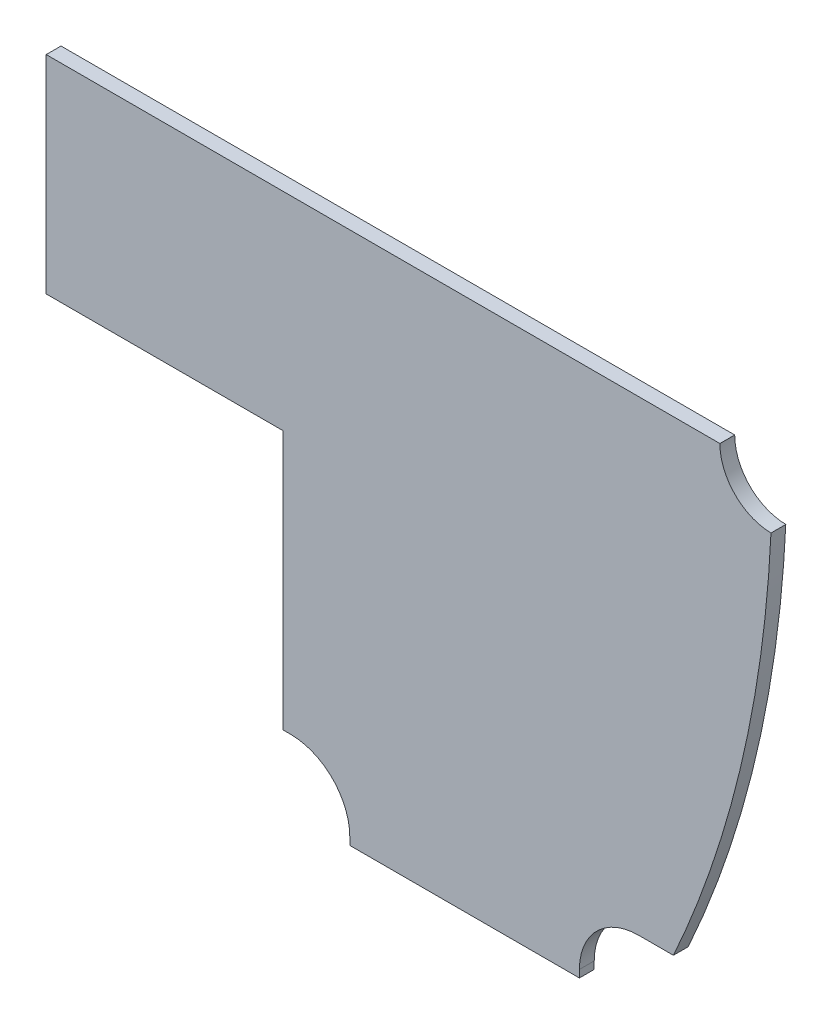
ISO-10303-21;
HEADER;
FILE_DESCRIPTION(('STEP AP214'),'2;1');
FILE_NAME('part.step','',(''),(''),'','','');
FILE_SCHEMA(('AUTOMOTIVE_DESIGN { 1 0 10303 214 1 1 1 1 }'));
ENDSEC;
DATA;
#1=APPLICATION_CONTEXT('core data for automotive mechanical design processes');
#2=APPLICATION_PROTOCOL_DEFINITION('international standard','automotive_design',2000,#1);
#3=PRODUCT_CONTEXT('',#1,'mechanical');
#4=PRODUCT('Part','Part','',(#3));
#5=PRODUCT_RELATED_PRODUCT_CATEGORY('part','',(#4));
#6=PRODUCT_DEFINITION_FORMATION('','',#4);
#7=PRODUCT_DEFINITION_CONTEXT('part definition',#1,'design');
#8=PRODUCT_DEFINITION('design','',#6,#7);
#9=PRODUCT_DEFINITION_SHAPE('','',#8);
#10=(LENGTH_UNIT() NAMED_UNIT(*) SI_UNIT(.MILLI.,.METRE.));
#11=(NAMED_UNIT(*) PLANE_ANGLE_UNIT() SI_UNIT($,.RADIAN.));
#12=(NAMED_UNIT(*) SI_UNIT($,.STERADIAN.) SOLID_ANGLE_UNIT());
#13=UNCERTAINTY_MEASURE_WITH_UNIT(LENGTH_MEASURE(1.E-05),#10,'distance_accuracy_value','');
#14=(GEOMETRIC_REPRESENTATION_CONTEXT(3) GLOBAL_UNCERTAINTY_ASSIGNED_CONTEXT((#13)) GLOBAL_UNIT_ASSIGNED_CONTEXT((#10,
#11,#12)) REPRESENTATION_CONTEXT('',''));
#15=CARTESIAN_POINT('',(0.,0.,0.));
#16=DIRECTION('',(0.,0.,1.));
#17=DIRECTION('',(1.,0.,0.));
#18=AXIS2_PLACEMENT_3D('',#15,#16,#17);
#19=CARTESIAN_POINT('',(-31.5080870807679,-0.500000000000001,1.));
#20=DIRECTION('',(0.,-1.,0.));
#21=DIRECTION('',(1.,0.,0.));
#22=AXIS2_PLACEMENT_3D('',#19,#20,#21);
#23=PLANE('',#22);
#24=DIRECTION('',(-1.,0.,0.));
#25=VECTOR('',#24,1.);
#26=CARTESIAN_POINT('',(-31.5080870807679,-0.500000000000001,0.));
#27=LINE('',#26,#25);
#28=CARTESIAN_POINT('',(-31.5080870807679,-0.500000000000001,0.));
#29=VERTEX_POINT('',#28);
#30=CARTESIAN_POINT('',(-77.0000000000001,-0.500000000000008,0.));
#31=VERTEX_POINT('',#30);
#32=EDGE_CURVE('E205',#29,#31,#27,.T.);
#33=ORIENTED_EDGE('',*,*,#32,.T.);
#34=DIRECTION('',(0.,0.,-1.));
#35=VECTOR('',#34,1.);
#36=CARTESIAN_POINT('',(-77.0000000000001,-0.500000000000008,1.));
#37=LINE('',#36,#35);
#38=CARTESIAN_POINT('',(-77.0000000000001,-0.500000000000008,1.));
#39=VERTEX_POINT('',#38);
#40=EDGE_CURVE('E11',#39,#31,#37,.T.);
#41=ORIENTED_EDGE('',*,*,#40,.F.);
#42=DIRECTION('',(-1.,0.,0.));
#43=VECTOR('',#42,1.);
#44=CARTESIAN_POINT('',(-31.5080870807679,-0.500000000000001,1.));
#45=LINE('',#44,#43);
#46=CARTESIAN_POINT('',(-31.5080870807679,-0.500000000000001,1.));
#47=VERTEX_POINT('',#46);
#48=EDGE_CURVE('E228',#47,#39,#45,.T.);
#49=ORIENTED_EDGE('',*,*,#48,.F.);
#50=DIRECTION('',(0.,0.,-1.));
#51=VECTOR('',#50,1.);
#52=CARTESIAN_POINT('',(-31.5080870807679,-0.500000000000001,1.));
#53=LINE('',#52,#51);
#54=EDGE_CURVE('E168',#47,#29,#53,.T.);
#55=ORIENTED_EDGE('',*,*,#54,.T.);
#56=EDGE_LOOP('',(#33,#41,#49,#55));
#57=FACE_BOUND('',#56,.T.);
#58=ADVANCED_FACE('F35',(#57),#23,.F.);
#59=CARTESIAN_POINT('',(-77.0000000000001,-0.500000000000008,1.));
#60=DIRECTION('',(1.,0.,0.));
#61=DIRECTION('',(0.,0.,-1.));
#62=AXIS2_PLACEMENT_3D('',#59,#60,#61);
#63=PLANE('',#62);
#64=DIRECTION('',(0.,-1.,0.));
#65=VECTOR('',#64,1.);
#66=CARTESIAN_POINT('',(-77.0000000000001,-0.500000000000008,0.));
#67=LINE('',#66,#65);
#68=CARTESIAN_POINT('',(-77.0000000000001,-14.5,0.));
#69=VERTEX_POINT('',#68);
#70=EDGE_CURVE('E208',#31,#69,#67,.T.);
#71=ORIENTED_EDGE('',*,*,#70,.T.);
#72=DIRECTION('',(0.,0.,-1.));
#73=VECTOR('',#72,1.);
#74=CARTESIAN_POINT('',(-77.0000000000001,-14.5,1.));
#75=LINE('',#74,#73);
#76=CARTESIAN_POINT('',(-77.0000000000001,-14.5,1.));
#77=VERTEX_POINT('',#76);
#78=EDGE_CURVE('E44',#77,#69,#75,.T.);
#79=ORIENTED_EDGE('',*,*,#78,.F.);
#80=DIRECTION('',(0.,-1.,0.));
#81=VECTOR('',#80,1.);
#82=CARTESIAN_POINT('',(-77.0000000000001,-0.500000000000008,1.));
#83=LINE('',#82,#81);
#84=EDGE_CURVE('E114',#39,#77,#83,.T.);
#85=ORIENTED_EDGE('',*,*,#84,.F.);
#86=ORIENTED_EDGE('',*,*,#40,.T.);
#87=EDGE_LOOP('',(#71,#79,#85,#86));
#88=FACE_BOUND('',#87,.T.);
#89=ADVANCED_FACE('F326',(#88),#63,.F.);
#90=CARTESIAN_POINT('',(-77.0000000000001,-14.5,1.));
#91=DIRECTION('',(0.,1.,0.));
#92=DIRECTION('',(0.,0.,1.));
#93=AXIS2_PLACEMENT_3D('',#90,#91,#92);
#94=PLANE('',#93);
#95=DIRECTION('',(1.,0.,0.));
#96=VECTOR('',#95,1.);
#97=CARTESIAN_POINT('',(-77.0000000000001,-14.5,0.));
#98=LINE('',#97,#96);
#99=CARTESIAN_POINT('',(-61.0000000000001,-14.5,0.));
#100=VERTEX_POINT('',#99);
#101=EDGE_CURVE('E210',#69,#100,#98,.T.);
#102=ORIENTED_EDGE('',*,*,#101,.T.);
#103=DIRECTION('',(0.,0.,-1.));
#104=VECTOR('',#103,1.);
#105=CARTESIAN_POINT('',(-61.0000000000001,-14.5,1.));
#106=LINE('',#105,#104);
#107=CARTESIAN_POINT('',(-61.0000000000001,-14.5,1.));
#108=VERTEX_POINT('',#107);
#109=EDGE_CURVE('E252',#108,#100,#106,.T.);
#110=ORIENTED_EDGE('',*,*,#109,.F.);
#111=DIRECTION('',(1.,0.,0.));
#112=VECTOR('',#111,1.);
#113=CARTESIAN_POINT('',(-77.0000000000001,-14.5,1.));
#114=LINE('',#113,#112);
#115=EDGE_CURVE('E261',#77,#108,#114,.T.);
#116=ORIENTED_EDGE('',*,*,#115,.F.);
#117=ORIENTED_EDGE('',*,*,#78,.T.);
#118=EDGE_LOOP('',(#102,#110,#116,#117));
#119=FACE_BOUND('',#118,.T.);
#120=ADVANCED_FACE('F259',(#119),#94,.F.);
#121=CARTESIAN_POINT('',(-61.0000000000001,-14.5,1.));
#122=DIRECTION('',(1.,0.,0.));
#123=DIRECTION('',(0.,0.,-1.));
#124=AXIS2_PLACEMENT_3D('',#121,#122,#123);
#125=PLANE('',#124);
#126=DIRECTION('',(0.,-1.,0.));
#127=VECTOR('',#126,1.);
#128=CARTESIAN_POINT('',(-61.0000000000001,-14.5,0.));
#129=LINE('',#128,#127);
#130=CARTESIAN_POINT('',(-61.0000000000001,-32.,0.));
#131=VERTEX_POINT('',#130);
#132=EDGE_CURVE('E212',#100,#131,#129,.T.);
#133=ORIENTED_EDGE('',*,*,#132,.T.);
#134=DIRECTION('',(0.,0.,-1.));
#135=VECTOR('',#134,1.);
#136=CARTESIAN_POINT('',(-61.0000000000001,-32.,1.));
#137=LINE('',#136,#135);
#138=CARTESIAN_POINT('',(-61.0000000000001,-32.,1.));
#139=VERTEX_POINT('',#138);
#140=EDGE_CURVE('E249',#139,#131,#137,.T.);
#141=ORIENTED_EDGE('',*,*,#140,.F.);
#142=DIRECTION('',(0.,-1.,0.));
#143=VECTOR('',#142,1.);
#144=CARTESIAN_POINT('',(-61.0000000000001,-14.5,1.));
#145=LINE('',#144,#143);
#146=EDGE_CURVE('E279',#108,#139,#145,.T.);
#147=ORIENTED_EDGE('',*,*,#146,.F.);
#148=ORIENTED_EDGE('',*,*,#109,.T.);
#149=EDGE_LOOP('',(#133,#141,#147,#148));
#150=FACE_BOUND('',#149,.T.);
#151=ADVANCED_FACE('F270',(#150),#125,.F.);
#152=CARTESIAN_POINT('',(-61.0000000000001,-32.,1.));
#153=DIRECTION('',(0.,1.,0.));
#154=DIRECTION('',(0.,0.,1.));
#155=AXIS2_PLACEMENT_3D('',#152,#153,#154);
#156=PLANE('',#155);
#157=DIRECTION('',(1.,0.,0.));
#158=VECTOR('',#157,1.);
#159=CARTESIAN_POINT('',(-61.0000000000001,-32.,0.));
#160=LINE('',#159,#158);
#161=CARTESIAN_POINT('',(-60.5000000000001,-32.,0.));
#162=VERTEX_POINT('',#161);
#163=EDGE_CURVE('E214',#131,#162,#160,.T.);
#164=ORIENTED_EDGE('',*,*,#163,.T.);
#165=DIRECTION('',(0.,0.,-1.));
#166=VECTOR('',#165,1.);
#167=CARTESIAN_POINT('',(-60.5000000000001,-32.,1.));
#168=LINE('',#167,#166);
#169=CARTESIAN_POINT('',(-60.5000000000001,-32.,1.));
#170=VERTEX_POINT('',#169);
#171=EDGE_CURVE('E246',#170,#162,#168,.T.);
#172=ORIENTED_EDGE('',*,*,#171,.F.);
#173=DIRECTION('',(1.,0.,0.));
#174=VECTOR('',#173,1.);
#175=CARTESIAN_POINT('',(-61.0000000000001,-32.,1.));
#176=LINE('',#175,#174);
#177=EDGE_CURVE('E276',#139,#170,#176,.T.);
#178=ORIENTED_EDGE('',*,*,#177,.F.);
#179=ORIENTED_EDGE('',*,*,#140,.T.);
#180=EDGE_LOOP('',(#164,#172,#178,#179));
#181=FACE_BOUND('',#180,.T.);
#182=ADVANCED_FACE('F274',(#181),#156,.F.);
#183=CARTESIAN_POINT('',(-60.5000000000001,-36.,1.));
#184=DIRECTION('',(0.,0.,-1.));
#185=DIRECTION('',(-1.,0.,0.));
#186=AXIS2_PLACEMENT_3D('',#183,#184,#185);
#187=CYLINDRICAL_SURFACE('',#186,4.);
#188=CARTESIAN_POINT('',(-60.5000000000001,-36.,0.));
#189=DIRECTION('',(0.,0.,-1.));
#190=DIRECTION('',(1.,0.,0.));
#191=AXIS2_PLACEMENT_3D('',#188,#189,#190);
#192=CIRCLE('',#191,4.);
#193=CARTESIAN_POINT('',(-56.5000000000001,-36.,0.));
#194=VERTEX_POINT('',#193);
#195=EDGE_CURVE('E216',#162,#194,#192,.T.);
#196=ORIENTED_EDGE('',*,*,#195,.T.);
#197=DIRECTION('',(0.,0.,-1.));
#198=VECTOR('',#197,1.);
#199=CARTESIAN_POINT('',(-56.5000000000001,-36.,1.));
#200=LINE('',#199,#198);
#201=CARTESIAN_POINT('',(-56.5000000000001,-36.,1.));
#202=VERTEX_POINT('',#201);
#203=EDGE_CURVE('E243',#202,#194,#200,.T.);
#204=ORIENTED_EDGE('',*,*,#203,.F.);
#205=CARTESIAN_POINT('',(-60.5000000000001,-36.,1.));
#206=DIRECTION('',(0.,0.,-1.));
#207=DIRECTION('',(1.,0.,0.));
#208=AXIS2_PLACEMENT_3D('',#205,#206,#207);
#209=CIRCLE('',#208,4.);
#210=EDGE_CURVE('E278',#170,#202,#209,.T.);
#211=ORIENTED_EDGE('',*,*,#210,.F.);
#212=ORIENTED_EDGE('',*,*,#171,.T.);
#213=EDGE_LOOP('',(#196,#204,#211,#212));
#214=FACE_BOUND('',#213,.T.);
#215=ADVANCED_FACE('F344',(#214),#187,.F.);
#216=CARTESIAN_POINT('',(-56.5000000000001,-36.,1.));
#217=DIRECTION('',(1.,0.,0.));
#218=DIRECTION('',(0.,0.,-1.));
#219=AXIS2_PLACEMENT_3D('',#216,#217,#218);
#220=PLANE('',#219);
#221=DIRECTION('',(0.,-1.,0.));
#222=VECTOR('',#221,1.);
#223=CARTESIAN_POINT('',(-56.5000000000001,-36.,0.));
#224=LINE('',#223,#222);
#225=CARTESIAN_POINT('',(-56.5000000000001,-36.499999999999,0.));
#226=VERTEX_POINT('',#225);
#227=EDGE_CURVE('E218',#194,#226,#224,.T.);
#228=ORIENTED_EDGE('',*,*,#227,.T.);
#229=DIRECTION('',(0.,0.,-1.));
#230=VECTOR('',#229,1.);
#231=CARTESIAN_POINT('',(-56.5000000000001,-36.499999999999,1.));
#232=LINE('',#231,#230);
#233=CARTESIAN_POINT('',(-56.5000000000001,-36.499999999999,1.));
#234=VERTEX_POINT('',#233);
#235=EDGE_CURVE('E240',#234,#226,#232,.T.);
#236=ORIENTED_EDGE('',*,*,#235,.F.);
#237=DIRECTION('',(0.,-1.,0.));
#238=VECTOR('',#237,1.);
#239=CARTESIAN_POINT('',(-56.5000000000001,-36.,1.));
#240=LINE('',#239,#238);
#241=EDGE_CURVE('E281',#202,#234,#240,.T.);
#242=ORIENTED_EDGE('',*,*,#241,.F.);
#243=ORIENTED_EDGE('',*,*,#203,.T.);
#244=EDGE_LOOP('',(#228,#236,#242,#243));
#245=FACE_BOUND('',#244,.T.);
#246=ADVANCED_FACE('F347',(#245),#220,.F.);
#247=CARTESIAN_POINT('',(-56.5000000000001,-36.499999999999,1.));
#248=DIRECTION('',(-1.58871572870506E-13,1.,0.));
#249=DIRECTION('',(-1.,-1.58871572870506E-13,0.));
#250=AXIS2_PLACEMENT_3D('',#247,#248,#249);
#251=PLANE('',#250);
#252=DIRECTION('',(1.,1.58871572870506E-13,0.));
#253=VECTOR('',#252,1.);
#254=CARTESIAN_POINT('',(-56.5000000000001,-36.499999999999,0.));
#255=LINE('',#254,#253);
#256=CARTESIAN_POINT('',(-40.9949773494414,-36.4999999999966,0.));
#257=VERTEX_POINT('',#256);
#258=EDGE_CURVE('E220',#226,#257,#255,.T.);
#259=ORIENTED_EDGE('',*,*,#258,.T.);
#260=DIRECTION('',(0.,0.,-1.));
#261=VECTOR('',#260,1.);
#262=CARTESIAN_POINT('',(-40.9949773494414,-36.4999999999966,1.));
#263=LINE('',#262,#261);
#264=CARTESIAN_POINT('',(-40.9949773494414,-36.4999999999966,1.));
#265=VERTEX_POINT('',#264);
#266=EDGE_CURVE('E237',#265,#257,#263,.T.);
#267=ORIENTED_EDGE('',*,*,#266,.F.);
#268=DIRECTION('',(1.,1.58871572870506E-13,0.));
#269=VECTOR('',#268,1.);
#270=CARTESIAN_POINT('',(-56.5000000000001,-36.499999999999,1.));
#271=LINE('',#270,#269);
#272=EDGE_CURVE('E287',#234,#265,#271,.T.);
#273=ORIENTED_EDGE('',*,*,#272,.F.);
#274=ORIENTED_EDGE('',*,*,#235,.T.);
#275=EDGE_LOOP('',(#259,#267,#273,#274));
#276=FACE_BOUND('',#275,.T.);
#277=ADVANCED_FACE('F351',(#276),#251,.F.);
#278=CARTESIAN_POINT('',(-40.9949773494414,-36.4999999999966,1.));
#279=DIRECTION('',(-1.,0.,0.));
#280=DIRECTION('',(0.,0.,1.));
#281=AXIS2_PLACEMENT_3D('',#278,#279,#280);
#282=PLANE('',#281);
#283=DIRECTION('',(0.,1.,0.));
#284=VECTOR('',#283,1.);
#285=CARTESIAN_POINT('',(-40.9949773494414,-36.4999999999966,0.));
#286=LINE('',#285,#284);
#287=CARTESIAN_POINT('',(-40.9949773494414,-36.,0.));
#288=VERTEX_POINT('',#287);
#289=EDGE_CURVE('E222',#257,#288,#286,.T.);
#290=ORIENTED_EDGE('',*,*,#289,.T.);
#291=DIRECTION('',(0.,0.,-1.));
#292=VECTOR('',#291,1.);
#293=CARTESIAN_POINT('',(-40.9949773494414,-36.,1.));
#294=LINE('',#293,#292);
#295=CARTESIAN_POINT('',(-40.9949773494414,-36.,1.));
#296=VERTEX_POINT('',#295);
#297=EDGE_CURVE('E234',#296,#288,#294,.T.);
#298=ORIENTED_EDGE('',*,*,#297,.F.);
#299=DIRECTION('',(0.,1.,0.));
#300=VECTOR('',#299,1.);
#301=CARTESIAN_POINT('',(-40.9949773494414,-36.4999999999966,1.));
#302=LINE('',#301,#300);
#303=EDGE_CURVE('E288',#265,#296,#302,.T.);
#304=ORIENTED_EDGE('',*,*,#303,.F.);
#305=ORIENTED_EDGE('',*,*,#266,.T.);
#306=EDGE_LOOP('',(#290,#298,#304,#305));
#307=FACE_BOUND('',#306,.T.);
#308=ADVANCED_FACE('F355',(#307),#282,.F.);
#309=CARTESIAN_POINT('',(-36.9949773494414,-36.,1.));
#310=DIRECTION('',(0.,0.,-1.));
#311=DIRECTION('',(-1.,0.,0.));
#312=AXIS2_PLACEMENT_3D('',#309,#310,#311);
#313=CYLINDRICAL_SURFACE('',#312,4.);
#314=CARTESIAN_POINT('',(-36.9949773494414,-36.,0.));
#315=DIRECTION('',(0.,0.,-1.));
#316=DIRECTION('',(1.,0.,0.));
#317=AXIS2_PLACEMENT_3D('',#314,#315,#316);
#318=CIRCLE('',#317,4.);
#319=CARTESIAN_POINT('',(-36.9949773494414,-32.,0.));
#320=VERTEX_POINT('',#319);
#321=EDGE_CURVE('E224',#288,#320,#318,.T.);
#322=ORIENTED_EDGE('',*,*,#321,.T.);
#323=DIRECTION('',(0.,0.,-1.));
#324=VECTOR('',#323,1.);
#325=CARTESIAN_POINT('',(-36.9949773494414,-32.,1.));
#326=LINE('',#325,#324);
#327=CARTESIAN_POINT('',(-36.9949773494414,-32.,1.));
#328=VERTEX_POINT('',#327);
#329=EDGE_CURVE('E231',#328,#320,#326,.T.);
#330=ORIENTED_EDGE('',*,*,#329,.F.);
#331=CARTESIAN_POINT('',(-36.9949773494414,-36.,1.));
#332=DIRECTION('',(0.,0.,-1.));
#333=DIRECTION('',(1.,0.,0.));
#334=AXIS2_PLACEMENT_3D('',#331,#332,#333);
#335=CIRCLE('',#334,4.);
#336=EDGE_CURVE('E199',#296,#328,#335,.T.);
#337=ORIENTED_EDGE('',*,*,#336,.F.);
#338=ORIENTED_EDGE('',*,*,#297,.T.);
#339=EDGE_LOOP('',(#322,#330,#337,#338));
#340=FACE_BOUND('',#339,.T.);
#341=ADVANCED_FACE('F358',(#340),#313,.F.);
#342=CARTESIAN_POINT('',(-36.9949773494414,-32.,1.));
#343=DIRECTION('',(1.03481144003033E-13,1.,0.));
#344=DIRECTION('',(-1.,1.03481144003033E-13,0.));
#345=AXIS2_PLACEMENT_3D('',#342,#343,#344);
#346=PLANE('',#345);
#347=DIRECTION('',(1.,-1.03481144003033E-13,0.));
#348=VECTOR('',#347,1.);
#349=CARTESIAN_POINT('',(-36.9949773494414,-32.,0.));
#350=LINE('',#349,#348);
#351=CARTESIAN_POINT('',(-34.6480639192069,-32.0000000000002,0.));
#352=VERTEX_POINT('',#351);
#353=EDGE_CURVE('E226',#320,#352,#350,.T.);
#354=ORIENTED_EDGE('',*,*,#353,.T.);
#355=DIRECTION('',(0.,0.,-1.));
#356=VECTOR('',#355,1.);
#357=CARTESIAN_POINT('',(-34.6480639192069,-32.0000000000002,1.));
#358=LINE('',#357,#356);
#359=CARTESIAN_POINT('',(-34.6480639192069,-32.0000000000002,1.));
#360=VERTEX_POINT('',#359);
#361=EDGE_CURVE('E163',#360,#352,#358,.T.);
#362=ORIENTED_EDGE('',*,*,#361,.F.);
#363=DIRECTION('',(1.,-1.03481144003033E-13,0.));
#364=VECTOR('',#363,1.);
#365=CARTESIAN_POINT('',(-36.9949773494414,-32.,1.));
#366=LINE('',#365,#364);
#367=EDGE_CURVE('E152',#328,#360,#366,.T.);
#368=ORIENTED_EDGE('',*,*,#367,.F.);
#369=ORIENTED_EDGE('',*,*,#329,.T.);
#370=EDGE_LOOP('',(#354,#362,#368,#369));
#371=FACE_BOUND('',#370,.T.);
#372=ADVANCED_FACE('F190',(#371),#346,.F.);
#373=CARTESIAN_POINT('',(-34.6480639192069,-32.0000000000002,1.));
#374=CARTESIAN_POINT('',(-33.6491880354554,-29.8015215161709,1.));
#375=CARTESIAN_POINT('',(-32.7631696486832,-27.5593569997167,1.));
#376=CARTESIAN_POINT('',(-31.6025887465951,-24.1309061644216,1.));
#377=CARTESIAN_POINT('',(-31.2439844554861,-22.9775538741894,1.));
#378=CARTESIAN_POINT('',(-30.5848836875617,-20.6579118531302,1.));
#379=CARTESIAN_POINT('',(-30.2840197175199,-19.4905747434658,1.));
#380=CARTESIAN_POINT('',(-29.7385212352957,-17.1411678991133,1.));
#381=CARTESIAN_POINT('',(-29.4937131522776,-15.957957975091,1.));
#382=CARTESIAN_POINT('',(-29.06076621332,-13.5858949282784,1.));
#383=CARTESIAN_POINT('',(-28.8722716394811,-12.396416472528,1.));
#384=CARTESIAN_POINT('',(-28.3880585547204,-8.81796875918336,1.));
#385=CARTESIAN_POINT('',(-28.1732904846666,-6.41902565611341,1.));
#386=CARTESIAN_POINT('',(-28.0588996288282,-4.0077182163259,1.));
#387=B_SPLINE_CURVE_WITH_KNOTS('',3,(#373,#374,#375,#376,#377,#378,#379,#380,#381,#382,#383,
#384,#385,#386),.UNSPECIFIED.,.F.,.F.,(4,2,2,2,2,2,4),(0.,0.25,0.375,0.5,0.625,0.75,1.),.UNSPECIFIED.);
#388=DIRECTION('',(0.,0.,-1.));
#389=VECTOR('',#388,1.);
#390=SURFACE_OF_LINEAR_EXTRUSION('',#387,#389);
#391=CARTESIAN_POINT('',(-34.6480639192069,-32.0000000000002,0.));
#392=CARTESIAN_POINT('',(-33.6491880354554,-29.8015215161709,0.));
#393=CARTESIAN_POINT('',(-32.7631696486832,-27.5593569997167,0.));
#394=CARTESIAN_POINT('',(-31.6025887465951,-24.1309061644216,0.));
#395=CARTESIAN_POINT('',(-31.2439844554861,-22.9775538741894,0.));
#396=CARTESIAN_POINT('',(-30.5848836875617,-20.6579118531302,0.));
#397=CARTESIAN_POINT('',(-30.2840197175199,-19.4905747434658,0.));
#398=CARTESIAN_POINT('',(-29.7385212352957,-17.1411678991133,0.));
#399=CARTESIAN_POINT('',(-29.4937131522776,-15.957957975091,0.));
#400=CARTESIAN_POINT('',(-29.06076621332,-13.5858949282784,0.));
#401=CARTESIAN_POINT('',(-28.8722716394811,-12.396416472528,0.));
#402=CARTESIAN_POINT('',(-28.3880585547204,-8.81796875918336,0.));
#403=CARTESIAN_POINT('',(-28.1732904846666,-6.41902565611341,0.));
#404=CARTESIAN_POINT('',(-28.0588996288282,-4.0077182163259,0.));
#405=B_SPLINE_CURVE_WITH_KNOTS('',3,(#391,#392,#393,#394,#395,#396,#397,#398,#399,#400,#401,
#402,#403,#404),.UNSPECIFIED.,.F.,.F.,(4,2,2,2,2,2,4),(0.,0.25,0.375,0.5,0.625,0.75,1.),.UNSPECIFIED.);
#406=CARTESIAN_POINT('',(-28.0588996288282,-4.0077182163259,0.));
#407=VERTEX_POINT('',#406);
#408=EDGE_CURVE('E161',#352,#407,#405,.T.);
#409=ORIENTED_EDGE('',*,*,#408,.T.);
#410=DIRECTION('',(0.,0.,-1.));
#411=VECTOR('',#410,1.);
#412=CARTESIAN_POINT('',(-28.0588996288282,-4.0077182163259,1.));
#413=LINE('',#412,#411);
#414=CARTESIAN_POINT('',(-28.0588996288282,-4.0077182163259,1.));
#415=VERTEX_POINT('',#414);
#416=EDGE_CURVE('E158',#415,#407,#413,.T.);
#417=ORIENTED_EDGE('',*,*,#416,.F.);
#418=CARTESIAN_POINT('',(-28.0588996288282,-4.0077182163259,1.));
#419=CARTESIAN_POINT('',(-28.1732904846666,-6.41902565611341,1.));
#420=CARTESIAN_POINT('',(-28.3880585547204,-8.81796875918336,1.));
#421=CARTESIAN_POINT('',(-28.8722716394811,-12.396416472528,1.));
#422=CARTESIAN_POINT('',(-29.06076621332,-13.5858949282784,1.));
#423=CARTESIAN_POINT('',(-29.4937131522776,-15.957957975091,1.));
#424=CARTESIAN_POINT('',(-29.7385212352957,-17.1411678991133,1.));
#425=CARTESIAN_POINT('',(-30.2840197175199,-19.4905747434658,1.));
#426=CARTESIAN_POINT('',(-30.5848836875617,-20.6579118531302,1.));
#427=CARTESIAN_POINT('',(-31.2439844554861,-22.9775538741894,1.));
#428=CARTESIAN_POINT('',(-31.6025887465951,-24.1309061644216,1.));
#429=CARTESIAN_POINT('',(-32.7631696486832,-27.5593569997167,1.));
#430=CARTESIAN_POINT('',(-33.6491880354554,-29.8015215161709,1.));
#431=CARTESIAN_POINT('',(-34.6480639192069,-32.0000000000002,1.));
#432=B_SPLINE_CURVE_WITH_KNOTS('',3,(#418,#419,#420,#421,#422,#423,#424,#425,#426,#427,#428,
#429,#430,#431),.UNSPECIFIED.,.F.,.F.,(4,2,2,2,2,2,4),(0.,0.25,0.375,0.5,0.625,0.75,1.),.UNSPECIFIED.);
#433=EDGE_CURVE('E145',#360,#415,#432,.F.);
#434=ORIENTED_EDGE('',*,*,#433,.F.);
#435=ORIENTED_EDGE('',*,*,#361,.T.);
#436=EDGE_LOOP('',(#409,#417,#434,#435));
#437=FACE_BOUND('',#436,.T.);
#438=ADVANCED_FACE('F159',(#437),#390,.F.);
#439=CARTESIAN_POINT('',(-28.0080870807679,-0.508087080768952,1.));
#440=DIRECTION('',(0.,0.,-1.));
#441=DIRECTION('',(-1.,0.,0.));
#442=AXIS2_PLACEMENT_3D('',#439,#440,#441);
#443=CYLINDRICAL_SURFACE('',#442,3.5);
#444=CARTESIAN_POINT('',(-28.0080870807679,-0.508087080768952,0.));
#445=DIRECTION('',(0.,0.,-1.));
#446=DIRECTION('',(1.,0.,0.));
#447=AXIS2_PLACEMENT_3D('',#444,#445,#446);
#448=CIRCLE('',#447,3.5);
#449=CARTESIAN_POINT('',(-31.5080870807679,-0.508087080768951,0.));
#450=VERTEX_POINT('',#449);
#451=EDGE_CURVE('E100',#407,#450,#448,.T.);
#452=ORIENTED_EDGE('',*,*,#451,.T.);
#453=DIRECTION('',(0.,0.,-1.));
#454=VECTOR('',#453,1.);
#455=CARTESIAN_POINT('',(-31.5080870807679,-0.508087080768951,1.));
#456=LINE('',#455,#454);
#457=CARTESIAN_POINT('',(-31.5080870807679,-0.508087080768951,1.));
#458=VERTEX_POINT('',#457);
#459=EDGE_CURVE('E164',#458,#450,#456,.T.);
#460=ORIENTED_EDGE('',*,*,#459,.F.);
#461=CARTESIAN_POINT('',(-28.0080870807679,-0.508087080768952,1.));
#462=DIRECTION('',(0.,0.,-1.));
#463=DIRECTION('',(1.,0.,0.));
#464=AXIS2_PLACEMENT_3D('',#461,#462,#463);
#465=CIRCLE('',#464,3.5);
#466=EDGE_CURVE('E150',#415,#458,#465,.T.);
#467=ORIENTED_EDGE('',*,*,#466,.F.);
#468=ORIENTED_EDGE('',*,*,#416,.T.);
#469=EDGE_LOOP('',(#452,#460,#467,#468));
#470=FACE_BOUND('',#469,.T.);
#471=ADVANCED_FACE('F166',(#470),#443,.F.);
#472=CARTESIAN_POINT('',(-31.5080870807679,-0.508087080768951,1.));
#473=DIRECTION('',(-1.,0.,0.));
#474=DIRECTION('',(0.,0.,1.));
#475=AXIS2_PLACEMENT_3D('',#472,#473,#474);
#476=PLANE('',#475);
#477=DIRECTION('',(0.,1.,0.));
#478=VECTOR('',#477,1.);
#479=CARTESIAN_POINT('',(-31.5080870807679,-0.508087080768951,0.));
#480=LINE('',#479,#478);
#481=EDGE_CURVE('E106',#450,#29,#480,.T.);
#482=ORIENTED_EDGE('',*,*,#481,.T.);
#483=ORIENTED_EDGE('',*,*,#54,.F.);
#484=DIRECTION('',(0.,1.,0.));
#485=VECTOR('',#484,1.);
#486=CARTESIAN_POINT('',(-31.5080870807679,-0.508087080768951,1.));
#487=LINE('',#486,#485);
#488=EDGE_CURVE('E53',#458,#47,#487,.T.);
#489=ORIENTED_EDGE('',*,*,#488,.F.);
#490=ORIENTED_EDGE('',*,*,#459,.T.);
#491=EDGE_LOOP('',(#482,#483,#489,#490));
#492=FACE_BOUND('',#491,.T.);
#493=ADVANCED_FACE('F319',(#492),#476,.F.);
#494=CARTESIAN_POINT('',(-60.5000000000001,-36.,1.));
#495=DIRECTION('',(0.,0.,1.));
#496=DIRECTION('',(1.,0.,0.));
#497=AXIS2_PLACEMENT_3D('',#494,#495,#496);
#498=PLANE('',#497);
#499=ORIENTED_EDGE('',*,*,#48,.T.);
#500=ORIENTED_EDGE('',*,*,#84,.T.);
#501=ORIENTED_EDGE('',*,*,#115,.T.);
#502=ORIENTED_EDGE('',*,*,#146,.T.);
#503=ORIENTED_EDGE('',*,*,#177,.T.);
#504=ORIENTED_EDGE('',*,*,#210,.T.);
#505=ORIENTED_EDGE('',*,*,#241,.T.);
#506=ORIENTED_EDGE('',*,*,#272,.T.);
#507=ORIENTED_EDGE('',*,*,#303,.T.);
#508=ORIENTED_EDGE('',*,*,#336,.T.);
#509=ORIENTED_EDGE('',*,*,#367,.T.);
#510=ORIENTED_EDGE('',*,*,#433,.T.);
#511=ORIENTED_EDGE('',*,*,#466,.T.);
#512=ORIENTED_EDGE('',*,*,#488,.T.);
#513=EDGE_LOOP('',(#499,#500,#501,#502,#503,#504,#505,#506,#507,#508,#509,#510,#511,#512));
#514=FACE_BOUND('',#513,.T.);
#515=ADVANCED_FACE('F148',(#514),#498,.T.);
#516=CARTESIAN_POINT('',(-60.5000000000001,-36.,0.));
#517=DIRECTION('',(0.,0.,1.));
#518=DIRECTION('',(1.,0.,0.));
#519=AXIS2_PLACEMENT_3D('',#516,#517,#518);
#520=PLANE('',#519);
#521=ORIENTED_EDGE('',*,*,#32,.F.);
#522=ORIENTED_EDGE('',*,*,#481,.F.);
#523=ORIENTED_EDGE('',*,*,#451,.F.);
#524=ORIENTED_EDGE('',*,*,#408,.F.);
#525=ORIENTED_EDGE('',*,*,#353,.F.);
#526=ORIENTED_EDGE('',*,*,#321,.F.);
#527=ORIENTED_EDGE('',*,*,#289,.F.);
#528=ORIENTED_EDGE('',*,*,#258,.F.);
#529=ORIENTED_EDGE('',*,*,#227,.F.);
#530=ORIENTED_EDGE('',*,*,#195,.F.);
#531=ORIENTED_EDGE('',*,*,#163,.F.);
#532=ORIENTED_EDGE('',*,*,#132,.F.);
#533=ORIENTED_EDGE('',*,*,#101,.F.);
#534=ORIENTED_EDGE('',*,*,#70,.F.);
#535=EDGE_LOOP('',(#521,#522,#523,#524,#525,#526,#527,#528,#529,#530,#531,#532,#533,#534));
#536=FACE_BOUND('',#535,.T.);
#537=ADVANCED_FACE('F265',(#536),#520,.F.);
#538=CLOSED_SHELL('',(#58,#89,#120,#151,#182,#215,#246,#277,#308,#341,#372,#438,#471,#493,#515,#537));
#539=MANIFOLD_SOLID_BREP('B2',#538);
#540=ADVANCED_BREP_SHAPE_REPRESENTATION('',(#18,#539),#14);
#541=SHAPE_DEFINITION_REPRESENTATION(#9,#540);
ENDSEC;
END-ISO-10303-21;
